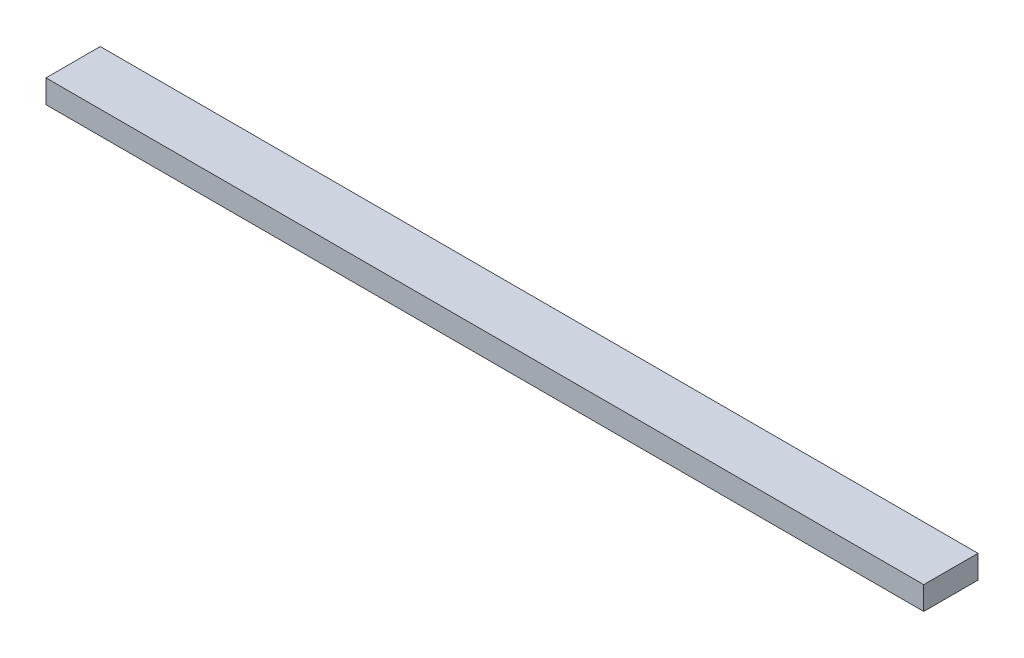
ISO-10303-21;
HEADER;
FILE_DESCRIPTION(('STEP AP214'),'2;1');
FILE_NAME('part.step','',(''),(''),'','','');
FILE_SCHEMA(('AUTOMOTIVE_DESIGN { 1 0 10303 214 1 1 1 1 }'));
ENDSEC;
DATA;
#1=APPLICATION_CONTEXT('core data for automotive mechanical design processes');
#2=APPLICATION_PROTOCOL_DEFINITION('international standard','automotive_design',2000,#1);
#3=PRODUCT_CONTEXT('',#1,'mechanical');
#4=PRODUCT('Part','Part','',(#3));
#5=PRODUCT_RELATED_PRODUCT_CATEGORY('part','',(#4));
#6=PRODUCT_DEFINITION_FORMATION('','',#4);
#7=PRODUCT_DEFINITION_CONTEXT('part definition',#1,'design');
#8=PRODUCT_DEFINITION('design','',#6,#7);
#9=PRODUCT_DEFINITION_SHAPE('','',#8);
#10=(LENGTH_UNIT() NAMED_UNIT(*) SI_UNIT(.MILLI.,.METRE.));
#11=(NAMED_UNIT(*) PLANE_ANGLE_UNIT() SI_UNIT($,.RADIAN.));
#12=(NAMED_UNIT(*) SI_UNIT($,.STERADIAN.) SOLID_ANGLE_UNIT());
#13=UNCERTAINTY_MEASURE_WITH_UNIT(LENGTH_MEASURE(1.E-05),#10,'distance_accuracy_value','');
#14=(GEOMETRIC_REPRESENTATION_CONTEXT(3) GLOBAL_UNCERTAINTY_ASSIGNED_CONTEXT((#13)) GLOBAL_UNIT_ASSIGNED_CONTEXT((#10,
#11,#12)) REPRESENTATION_CONTEXT('',''));
#15=CARTESIAN_POINT('',(0.,0.,0.));
#16=DIRECTION('',(0.,0.,1.));
#17=DIRECTION('',(1.,0.,0.));
#18=AXIS2_PLACEMENT_3D('',#15,#16,#17);
#19=CARTESIAN_POINT('',(1438.275,0.,0.));
#20=DIRECTION('',(0.,0.,-1.));
#21=DIRECTION('',(-1.,0.,0.));
#22=AXIS2_PLACEMENT_3D('',#19,#20,#21);
#23=PLANE('',#22);
#24=DIRECTION('',(0.,-1.,0.));
#25=VECTOR('',#24,1.);
#26=CARTESIAN_POINT('',(0.,0.,0.));
#27=LINE('',#26,#25);
#28=CARTESIAN_POINT('',(0.,38.1,0.));
#29=VERTEX_POINT('',#28);
#30=CARTESIAN_POINT('',(0.,0.,0.));
#31=VERTEX_POINT('',#30);
#32=EDGE_CURVE('E110',#29,#31,#27,.T.);
#33=ORIENTED_EDGE('',*,*,#32,.T.);
#34=DIRECTION('',(-1.,0.,0.));
#35=VECTOR('',#34,1.);
#36=CARTESIAN_POINT('',(1438.275,0.,0.));
#37=LINE('',#36,#35);
#38=CARTESIAN_POINT('',(1438.275,0.,0.));
#39=VERTEX_POINT('',#38);
#40=EDGE_CURVE('E11',#39,#31,#37,.T.);
#41=ORIENTED_EDGE('',*,*,#40,.F.);
#42=DIRECTION('',(0.,-1.,0.));
#43=VECTOR('',#42,1.);
#44=CARTESIAN_POINT('',(1438.275,0.,0.));
#45=LINE('',#44,#43);
#46=CARTESIAN_POINT('',(1438.275,38.1,0.));
#47=VERTEX_POINT('',#46);
#48=EDGE_CURVE('E93',#47,#39,#45,.T.);
#49=ORIENTED_EDGE('',*,*,#48,.F.);
#50=DIRECTION('',(-1.,0.,0.));
#51=VECTOR('',#50,1.);
#52=CARTESIAN_POINT('',(1438.275,38.1,0.));
#53=LINE('',#52,#51);
#54=EDGE_CURVE('E106',#47,#29,#53,.T.);
#55=ORIENTED_EDGE('',*,*,#54,.T.);
#56=EDGE_LOOP('',(#33,#41,#49,#55));
#57=FACE_BOUND('',#56,.T.);
#58=ADVANCED_FACE('F41',(#57),#23,.F.);
#59=CARTESIAN_POINT('',(1438.275,0.,0.));
#60=DIRECTION('',(0.,1.,0.));
#61=DIRECTION('',(0.,0.,1.));
#62=AXIS2_PLACEMENT_3D('',#59,#60,#61);
#63=PLANE('',#62);
#64=DIRECTION('',(0.,0.,-1.));
#65=VECTOR('',#64,1.);
#66=CARTESIAN_POINT('',(0.,0.,0.));
#67=LINE('',#66,#65);
#68=CARTESIAN_POINT('',(0.,0.,-88.9));
#69=VERTEX_POINT('',#68);
#70=EDGE_CURVE('E98',#31,#69,#67,.T.);
#71=ORIENTED_EDGE('',*,*,#70,.T.);
#72=DIRECTION('',(-1.,0.,0.));
#73=VECTOR('',#72,1.);
#74=CARTESIAN_POINT('',(1438.275,0.,-88.9));
#75=LINE('',#74,#73);
#76=CARTESIAN_POINT('',(1438.275,0.,-88.9));
#77=VERTEX_POINT('',#76);
#78=EDGE_CURVE('E50',#77,#69,#75,.T.);
#79=ORIENTED_EDGE('',*,*,#78,.F.);
#80=DIRECTION('',(0.,0.,-1.));
#81=VECTOR('',#80,1.);
#82=CARTESIAN_POINT('',(1438.275,0.,0.));
#83=LINE('',#82,#81);
#84=EDGE_CURVE('E88',#39,#77,#83,.T.);
#85=ORIENTED_EDGE('',*,*,#84,.F.);
#86=ORIENTED_EDGE('',*,*,#40,.T.);
#87=EDGE_LOOP('',(#71,#79,#85,#86));
#88=FACE_BOUND('',#87,.T.);
#89=ADVANCED_FACE('F97',(#88),#63,.F.);
#90=CARTESIAN_POINT('',(1438.275,0.,-88.9));
#91=DIRECTION('',(0.,0.,1.));
#92=DIRECTION('',(1.,0.,0.));
#93=AXIS2_PLACEMENT_3D('',#90,#91,#92);
#94=PLANE('',#93);
#95=DIRECTION('',(0.,1.,0.));
#96=VECTOR('',#95,1.);
#97=CARTESIAN_POINT('',(0.,0.,-88.9));
#98=LINE('',#97,#96);
#99=CARTESIAN_POINT('',(0.,38.1,-88.9));
#100=VERTEX_POINT('',#99);
#101=EDGE_CURVE('E75',#69,#100,#98,.T.);
#102=ORIENTED_EDGE('',*,*,#101,.T.);
#103=DIRECTION('',(-1.,0.,0.));
#104=VECTOR('',#103,1.);
#105=CARTESIAN_POINT('',(1438.275,38.1,-88.9));
#106=LINE('',#105,#104);
#107=CARTESIAN_POINT('',(1438.275,38.1,-88.9));
#108=VERTEX_POINT('',#107);
#109=EDGE_CURVE('E100',#108,#100,#106,.T.);
#110=ORIENTED_EDGE('',*,*,#109,.F.);
#111=DIRECTION('',(0.,1.,0.));
#112=VECTOR('',#111,1.);
#113=CARTESIAN_POINT('',(1438.275,0.,-88.9));
#114=LINE('',#113,#112);
#115=EDGE_CURVE('E91',#77,#108,#114,.T.);
#116=ORIENTED_EDGE('',*,*,#115,.F.);
#117=ORIENTED_EDGE('',*,*,#78,.T.);
#118=EDGE_LOOP('',(#102,#110,#116,#117));
#119=FACE_BOUND('',#118,.T.);
#120=ADVANCED_FACE('F101',(#119),#94,.F.);
#121=CARTESIAN_POINT('',(1438.275,38.1,0.));
#122=DIRECTION('',(0.,-1.,0.));
#123=DIRECTION('',(0.,0.,-1.));
#124=AXIS2_PLACEMENT_3D('',#121,#122,#123);
#125=PLANE('',#124);
#126=DIRECTION('',(0.,0.,1.));
#127=VECTOR('',#126,1.);
#128=CARTESIAN_POINT('',(0.,38.1,0.));
#129=LINE('',#128,#127);
#130=EDGE_CURVE('E81',#100,#29,#129,.T.);
#131=ORIENTED_EDGE('',*,*,#130,.T.);
#132=ORIENTED_EDGE('',*,*,#54,.F.);
#133=DIRECTION('',(0.,0.,1.));
#134=VECTOR('',#133,1.);
#135=CARTESIAN_POINT('',(1438.275,38.1,0.));
#136=LINE('',#135,#134);
#137=EDGE_CURVE('E58',#108,#47,#136,.T.);
#138=ORIENTED_EDGE('',*,*,#137,.F.);
#139=ORIENTED_EDGE('',*,*,#109,.T.);
#140=EDGE_LOOP('',(#131,#132,#138,#139));
#141=FACE_BOUND('',#140,.T.);
#142=ADVANCED_FACE('F124',(#141),#125,.F.);
#143=CARTESIAN_POINT('',(1438.275,0.,0.));
#144=DIRECTION('',(-1.,0.,0.));
#145=DIRECTION('',(0.,0.,1.));
#146=AXIS2_PLACEMENT_3D('',#143,#144,#145);
#147=PLANE('',#146);
#148=ORIENTED_EDGE('',*,*,#48,.T.);
#149=ORIENTED_EDGE('',*,*,#84,.T.);
#150=ORIENTED_EDGE('',*,*,#115,.T.);
#151=ORIENTED_EDGE('',*,*,#137,.T.);
#152=EDGE_LOOP('',(#148,#149,#150,#151));
#153=FACE_BOUND('',#152,.T.);
#154=ADVANCED_FACE('F89',(#153),#147,.F.);
#155=CARTESIAN_POINT('',(0.,0.,0.));
#156=DIRECTION('',(-1.,0.,0.));
#157=DIRECTION('',(0.,0.,1.));
#158=AXIS2_PLACEMENT_3D('',#155,#156,#157);
#159=PLANE('',#158);
#160=ORIENTED_EDGE('',*,*,#32,.F.);
#161=ORIENTED_EDGE('',*,*,#130,.F.);
#162=ORIENTED_EDGE('',*,*,#101,.F.);
#163=ORIENTED_EDGE('',*,*,#70,.F.);
#164=EDGE_LOOP('',(#160,#161,#162,#163));
#165=FACE_BOUND('',#164,.T.);
#166=ADVANCED_FACE('F127',(#165),#159,.T.);
#167=CLOSED_SHELL('',(#58,#89,#120,#142,#154,#166));
#168=MANIFOLD_SOLID_BREP('B2',#167);
#169=ADVANCED_BREP_SHAPE_REPRESENTATION('',(#18,#168),#14);
#170=SHAPE_DEFINITION_REPRESENTATION(#9,#169);
ENDSEC;
END-ISO-10303-21;
